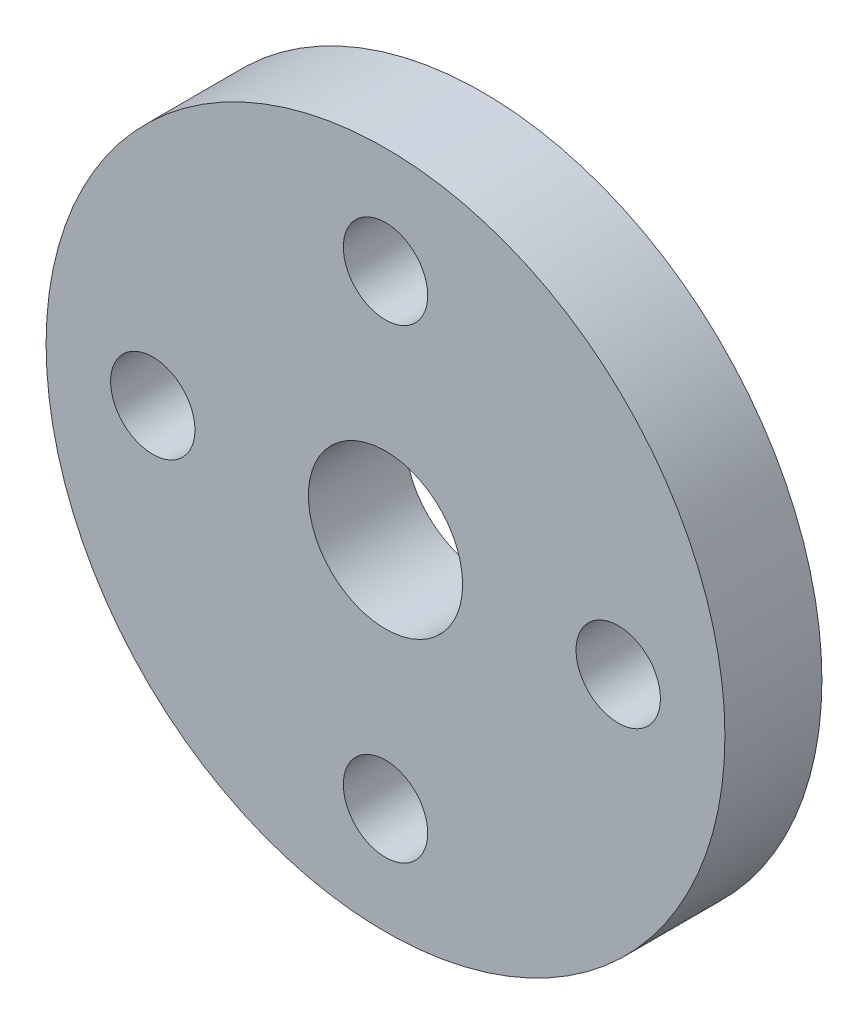
ISO-10303-21;
HEADER;
FILE_DESCRIPTION(('STEP AP214'),'2;1');
FILE_NAME('part.step','',(''),(''),'','','');
FILE_SCHEMA(('AUTOMOTIVE_DESIGN { 1 0 10303 214 1 1 1 1 }'));
ENDSEC;
DATA;
#1=APPLICATION_CONTEXT('core data for automotive mechanical design processes');
#2=APPLICATION_PROTOCOL_DEFINITION('international standard','automotive_design',2000,#1);
#3=PRODUCT_CONTEXT('',#1,'mechanical');
#4=PRODUCT('Part','Part','',(#3));
#5=PRODUCT_RELATED_PRODUCT_CATEGORY('part','',(#4));
#6=PRODUCT_DEFINITION_FORMATION('','',#4);
#7=PRODUCT_DEFINITION_CONTEXT('part definition',#1,'design');
#8=PRODUCT_DEFINITION('design','',#6,#7);
#9=PRODUCT_DEFINITION_SHAPE('','',#8);
#10=(LENGTH_UNIT() NAMED_UNIT(*) SI_UNIT(.MILLI.,.METRE.));
#11=(NAMED_UNIT(*) PLANE_ANGLE_UNIT() SI_UNIT($,.RADIAN.));
#12=(NAMED_UNIT(*) SI_UNIT($,.STERADIAN.) SOLID_ANGLE_UNIT());
#13=UNCERTAINTY_MEASURE_WITH_UNIT(LENGTH_MEASURE(1.E-05),#10,'distance_accuracy_value','');
#14=(GEOMETRIC_REPRESENTATION_CONTEXT(3) GLOBAL_UNCERTAINTY_ASSIGNED_CONTEXT((#13)) GLOBAL_UNIT_ASSIGNED_CONTEXT((#10,
#11,#12)) REPRESENTATION_CONTEXT('',''));
#15=CARTESIAN_POINT('',(0.,0.,0.));
#16=DIRECTION('',(0.,0.,1.));
#17=DIRECTION('',(1.,0.,0.));
#18=AXIS2_PLACEMENT_3D('',#15,#16,#17);
#19=CARTESIAN_POINT('',(0.,0.,5.));
#20=DIRECTION('',(0.,0.,1.));
#21=DIRECTION('',(1.,0.,0.));
#22=AXIS2_PLACEMENT_3D('',#19,#20,#21);
#23=PLANE('',#22);
#24=CARTESIAN_POINT('',(-12.,0.,5.));
#25=DIRECTION('',(0.,0.,1.));
#26=DIRECTION('',(1.,0.,0.));
#27=AXIS2_PLACEMENT_3D('',#24,#25,#26);
#28=CIRCLE('',#27,2.175);
#29=CARTESIAN_POINT('',(-9.825,0.,5.));
#30=VERTEX_POINT('',#29);
#31=EDGE_CURVE('E59',#30,#30,#28,.T.);
#32=ORIENTED_EDGE('',*,*,#31,.F.);
#33=EDGE_LOOP('',(#32));
#34=FACE_BOUND('',#33,.T.);
#35=CARTESIAN_POINT('',(12.,0.,5.));
#36=DIRECTION('',(0.,0.,1.));
#37=DIRECTION('',(1.,0.,0.));
#38=AXIS2_PLACEMENT_3D('',#35,#36,#37);
#39=CIRCLE('',#38,2.175);
#40=CARTESIAN_POINT('',(14.175,0.,5.));
#41=VERTEX_POINT('',#40);
#42=EDGE_CURVE('E47',#41,#41,#39,.T.);
#43=ORIENTED_EDGE('',*,*,#42,.F.);
#44=EDGE_LOOP('',(#43));
#45=FACE_BOUND('',#44,.T.);
#46=CARTESIAN_POINT('',(0.,0.,5.));
#47=DIRECTION('',(0.,0.,1.));
#48=DIRECTION('',(1.,0.,0.));
#49=AXIS2_PLACEMENT_3D('',#46,#47,#48);
#50=CIRCLE('',#49,17.5);
#51=CARTESIAN_POINT('',(17.5,0.,5.));
#52=VERTEX_POINT('',#51);
#53=EDGE_CURVE('E10',#52,#52,#50,.T.);
#54=ORIENTED_EDGE('',*,*,#53,.T.);
#55=EDGE_LOOP('',(#54));
#56=FACE_BOUND('',#55,.T.);
#57=CARTESIAN_POINT('',(0.,0.,5.));
#58=DIRECTION('',(0.,0.,1.));
#59=DIRECTION('',(1.,0.,0.));
#60=AXIS2_PLACEMENT_3D('',#57,#58,#59);
#61=CIRCLE('',#60,3.975);
#62=CARTESIAN_POINT('',(3.975,0.,5.));
#63=VERTEX_POINT('',#62);
#64=EDGE_CURVE('E42',#63,#63,#61,.T.);
#65=ORIENTED_EDGE('',*,*,#64,.F.);
#66=EDGE_LOOP('',(#65));
#67=FACE_BOUND('',#66,.T.);
#68=CARTESIAN_POINT('',(0.,12.,5.));
#69=DIRECTION('',(0.,0.,1.));
#70=DIRECTION('',(1.,0.,0.));
#71=AXIS2_PLACEMENT_3D('',#68,#69,#70);
#72=CIRCLE('',#71,2.175);
#73=CARTESIAN_POINT('',(2.175,12.,5.));
#74=VERTEX_POINT('',#73);
#75=EDGE_CURVE('E53',#74,#74,#72,.T.);
#76=ORIENTED_EDGE('',*,*,#75,.F.);
#77=EDGE_LOOP('',(#76));
#78=FACE_BOUND('',#77,.T.);
#79=CARTESIAN_POINT('',(0.,-12.,5.));
#80=DIRECTION('',(0.,0.,1.));
#81=DIRECTION('',(1.,0.,0.));
#82=AXIS2_PLACEMENT_3D('',#79,#80,#81);
#83=CIRCLE('',#82,2.175);
#84=CARTESIAN_POINT('',(2.175,-12.,5.));
#85=VERTEX_POINT('',#84);
#86=EDGE_CURVE('E65',#85,#85,#83,.T.);
#87=ORIENTED_EDGE('',*,*,#86,.F.);
#88=EDGE_LOOP('',(#87));
#89=FACE_BOUND('',#88,.T.);
#90=ADVANCED_FACE('F31',(#34,#45,#56,#67,#78,#89),#23,.T.);
#91=CARTESIAN_POINT('',(0.,0.,0.));
#92=DIRECTION('',(0.,0.,1.));
#93=DIRECTION('',(1.,0.,0.));
#94=AXIS2_PLACEMENT_3D('',#91,#92,#93);
#95=PLANE('',#94);
#96=CARTESIAN_POINT('',(0.,0.,0.));
#97=DIRECTION('',(0.,0.,1.));
#98=DIRECTION('',(1.,0.,0.));
#99=AXIS2_PLACEMENT_3D('',#96,#97,#98);
#100=CIRCLE('',#99,17.5);
#101=CARTESIAN_POINT('',(17.5,0.,0.));
#102=VERTEX_POINT('',#101);
#103=EDGE_CURVE('E35',#102,#102,#100,.T.);
#104=ORIENTED_EDGE('',*,*,#103,.F.);
#105=EDGE_LOOP('',(#104));
#106=FACE_BOUND('',#105,.T.);
#107=CARTESIAN_POINT('',(0.,0.,0.));
#108=DIRECTION('',(0.,0.,1.));
#109=DIRECTION('',(1.,0.,0.));
#110=AXIS2_PLACEMENT_3D('',#107,#108,#109);
#111=CIRCLE('',#110,3.975);
#112=CARTESIAN_POINT('',(3.975,0.,0.));
#113=VERTEX_POINT('',#112);
#114=EDGE_CURVE('E44',#113,#113,#111,.T.);
#115=ORIENTED_EDGE('',*,*,#114,.T.);
#116=EDGE_LOOP('',(#115));
#117=FACE_BOUND('',#116,.T.);
#118=CARTESIAN_POINT('',(12.,0.,0.));
#119=DIRECTION('',(0.,0.,1.));
#120=DIRECTION('',(1.,0.,0.));
#121=AXIS2_PLACEMENT_3D('',#118,#119,#120);
#122=CIRCLE('',#121,2.175);
#123=CARTESIAN_POINT('',(14.175,0.,0.));
#124=VERTEX_POINT('',#123);
#125=EDGE_CURVE('E50',#124,#124,#122,.T.);
#126=ORIENTED_EDGE('',*,*,#125,.T.);
#127=EDGE_LOOP('',(#126));
#128=FACE_BOUND('',#127,.T.);
#129=CARTESIAN_POINT('',(0.,12.,0.));
#130=DIRECTION('',(0.,0.,1.));
#131=DIRECTION('',(1.,0.,0.));
#132=AXIS2_PLACEMENT_3D('',#129,#130,#131);
#133=CIRCLE('',#132,2.175);
#134=CARTESIAN_POINT('',(2.175,12.,0.));
#135=VERTEX_POINT('',#134);
#136=EDGE_CURVE('E56',#135,#135,#133,.T.);
#137=ORIENTED_EDGE('',*,*,#136,.T.);
#138=EDGE_LOOP('',(#137));
#139=FACE_BOUND('',#138,.T.);
#140=CARTESIAN_POINT('',(-12.,0.,0.));
#141=DIRECTION('',(0.,0.,1.));
#142=DIRECTION('',(1.,0.,0.));
#143=AXIS2_PLACEMENT_3D('',#140,#141,#142);
#144=CIRCLE('',#143,2.175);
#145=CARTESIAN_POINT('',(-9.825,0.,0.));
#146=VERTEX_POINT('',#145);
#147=EDGE_CURVE('E62',#146,#146,#144,.T.);
#148=ORIENTED_EDGE('',*,*,#147,.T.);
#149=EDGE_LOOP('',(#148));
#150=FACE_BOUND('',#149,.T.);
#151=CARTESIAN_POINT('',(0.,-12.,0.));
#152=DIRECTION('',(0.,0.,1.));
#153=DIRECTION('',(1.,0.,0.));
#154=AXIS2_PLACEMENT_3D('',#151,#152,#153);
#155=CIRCLE('',#154,2.175);
#156=CARTESIAN_POINT('',(2.175,-12.,0.));
#157=VERTEX_POINT('',#156);
#158=EDGE_CURVE('E68',#157,#157,#155,.T.);
#159=ORIENTED_EDGE('',*,*,#158,.T.);
#160=EDGE_LOOP('',(#159));
#161=FACE_BOUND('',#160,.T.);
#162=ADVANCED_FACE('F78',(#106,#117,#128,#139,#150,#161),#95,.F.);
#163=CARTESIAN_POINT('',(0.,0.,5.));
#164=DIRECTION('',(0.,0.,-1.));
#165=DIRECTION('',(-1.,0.,0.));
#166=AXIS2_PLACEMENT_3D('',#163,#164,#165);
#167=CYLINDRICAL_SURFACE('',#166,17.5);
#168=ORIENTED_EDGE('',*,*,#53,.F.);
#169=EDGE_LOOP('',(#168));
#170=FACE_BOUND('',#169,.T.);
#171=ORIENTED_EDGE('',*,*,#103,.T.);
#172=EDGE_LOOP('',(#171));
#173=FACE_BOUND('',#172,.T.);
#174=ADVANCED_FACE('F33',(#170,#173),#167,.T.);
#175=CARTESIAN_POINT('',(0.,0.,5.));
#176=DIRECTION('',(0.,0.,-1.));
#177=DIRECTION('',(-1.,0.,0.));
#178=AXIS2_PLACEMENT_3D('',#175,#176,#177);
#179=CYLINDRICAL_SURFACE('',#178,3.975);
#180=ORIENTED_EDGE('',*,*,#64,.T.);
#181=EDGE_LOOP('',(#180));
#182=FACE_BOUND('',#181,.T.);
#183=ORIENTED_EDGE('',*,*,#114,.F.);
#184=EDGE_LOOP('',(#183));
#185=FACE_BOUND('',#184,.T.);
#186=ADVANCED_FACE('F88',(#182,#185),#179,.F.);
#187=CARTESIAN_POINT('',(12.,0.,5.));
#188=DIRECTION('',(0.,0.,-1.));
#189=DIRECTION('',(-1.,0.,0.));
#190=AXIS2_PLACEMENT_3D('',#187,#188,#189);
#191=CYLINDRICAL_SURFACE('',#190,2.175);
#192=ORIENTED_EDGE('',*,*,#42,.T.);
#193=EDGE_LOOP('',(#192));
#194=FACE_BOUND('',#193,.T.);
#195=ORIENTED_EDGE('',*,*,#125,.F.);
#196=EDGE_LOOP('',(#195));
#197=FACE_BOUND('',#196,.T.);
#198=ADVANCED_FACE('F91',(#194,#197),#191,.F.);
#199=CARTESIAN_POINT('',(0.,12.,5.));
#200=DIRECTION('',(0.,0.,-1.));
#201=DIRECTION('',(-1.,0.,0.));
#202=AXIS2_PLACEMENT_3D('',#199,#200,#201);
#203=CYLINDRICAL_SURFACE('',#202,2.175);
#204=ORIENTED_EDGE('',*,*,#75,.T.);
#205=EDGE_LOOP('',(#204));
#206=FACE_BOUND('',#205,.T.);
#207=ORIENTED_EDGE('',*,*,#136,.F.);
#208=EDGE_LOOP('',(#207));
#209=FACE_BOUND('',#208,.T.);
#210=ADVANCED_FACE('F95',(#206,#209),#203,.F.);
#211=CARTESIAN_POINT('',(-12.,0.,5.));
#212=DIRECTION('',(0.,0.,-1.));
#213=DIRECTION('',(-1.,0.,0.));
#214=AXIS2_PLACEMENT_3D('',#211,#212,#213);
#215=CYLINDRICAL_SURFACE('',#214,2.175);
#216=ORIENTED_EDGE('',*,*,#31,.T.);
#217=EDGE_LOOP('',(#216));
#218=FACE_BOUND('',#217,.T.);
#219=ORIENTED_EDGE('',*,*,#147,.F.);
#220=EDGE_LOOP('',(#219));
#221=FACE_BOUND('',#220,.T.);
#222=ADVANCED_FACE('F99',(#218,#221),#215,.F.);
#223=CARTESIAN_POINT('',(0.,-12.,5.));
#224=DIRECTION('',(0.,0.,-1.));
#225=DIRECTION('',(-1.,0.,0.));
#226=AXIS2_PLACEMENT_3D('',#223,#224,#225);
#227=CYLINDRICAL_SURFACE('',#226,2.175);
#228=ORIENTED_EDGE('',*,*,#86,.T.);
#229=EDGE_LOOP('',(#228));
#230=FACE_BOUND('',#229,.T.);
#231=ORIENTED_EDGE('',*,*,#158,.F.);
#232=EDGE_LOOP('',(#231));
#233=FACE_BOUND('',#232,.T.);
#234=ADVANCED_FACE('F74',(#230,#233),#227,.F.);
#235=CLOSED_SHELL('',(#90,#162,#174,#186,#198,#210,#222,#234));
#236=MANIFOLD_SOLID_BREP('B2',#235);
#237=ADVANCED_BREP_SHAPE_REPRESENTATION('',(#18,#236),#14);
#238=SHAPE_DEFINITION_REPRESENTATION(#9,#237);
ENDSEC;
END-ISO-10303-21;
